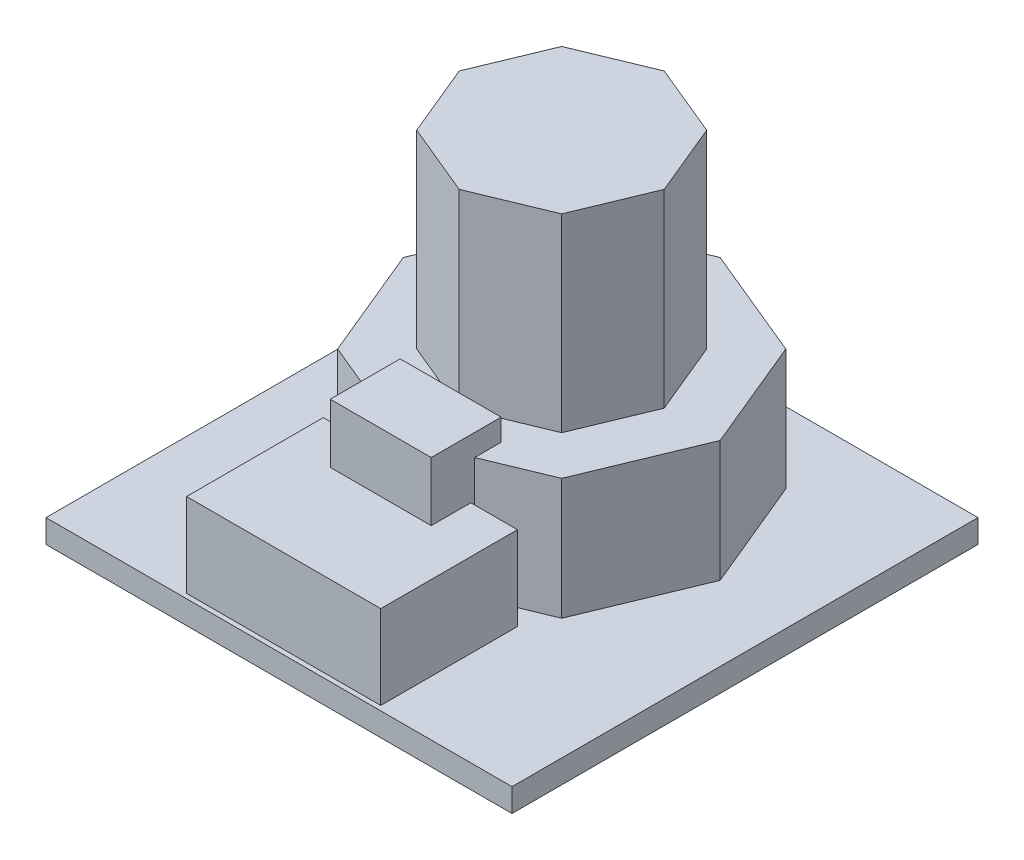
ISO-10303-21;
HEADER;
FILE_DESCRIPTION(('STEP AP214'),'2;1');
FILE_NAME('part.step','',(''),(''),'','','');
FILE_SCHEMA(('AUTOMOTIVE_DESIGN { 1 0 10303 214 1 1 1 1 }'));
ENDSEC;
DATA;
#1=APPLICATION_CONTEXT('core data for automotive mechanical design processes');
#2=APPLICATION_PROTOCOL_DEFINITION('international standard','automotive_design',2000,#1);
#3=PRODUCT_CONTEXT('',#1,'mechanical');
#4=PRODUCT('Part','Part','',(#3));
#5=PRODUCT_RELATED_PRODUCT_CATEGORY('part','',(#4));
#6=PRODUCT_DEFINITION_FORMATION('','',#4);
#7=PRODUCT_DEFINITION_CONTEXT('part definition',#1,'design');
#8=PRODUCT_DEFINITION('design','',#6,#7);
#9=PRODUCT_DEFINITION_SHAPE('','',#8);
#10=(LENGTH_UNIT() NAMED_UNIT(*) SI_UNIT(.MILLI.,.METRE.));
#11=(NAMED_UNIT(*) PLANE_ANGLE_UNIT() SI_UNIT($,.RADIAN.));
#12=(NAMED_UNIT(*) SI_UNIT($,.STERADIAN.) SOLID_ANGLE_UNIT());
#13=UNCERTAINTY_MEASURE_WITH_UNIT(LENGTH_MEASURE(1.E-05),#10,'distance_accuracy_value','');
#14=(GEOMETRIC_REPRESENTATION_CONTEXT(3) GLOBAL_UNCERTAINTY_ASSIGNED_CONTEXT((#13)) GLOBAL_UNIT_ASSIGNED_CONTEXT((#10,
#11,#12)) REPRESENTATION_CONTEXT('',''));
#15=CARTESIAN_POINT('',(0.,0.,0.));
#16=DIRECTION('',(0.,0.,1.));
#17=DIRECTION('',(1.,0.,0.));
#18=AXIS2_PLACEMENT_3D('',#15,#16,#17);
#19=CARTESIAN_POINT('',(0.,0.,0.));
#20=DIRECTION('',(0.,-1.,0.));
#21=DIRECTION('',(0.,0.,-1.));
#22=AXIS2_PLACEMENT_3D('',#19,#20,#21);
#23=PLANE('',#22);
#24=DIRECTION('',(0.,0.,-1.));
#25=VECTOR('',#24,1.);
#26=CARTESIAN_POINT('',(150.,0.,150.));
#27=LINE('',#26,#25);
#28=CARTESIAN_POINT('',(150.,0.,150.));
#29=VERTEX_POINT('',#28);
#30=CARTESIAN_POINT('',(150.,0.,-150.));
#31=VERTEX_POINT('',#30);
#32=EDGE_CURVE('E425',#29,#31,#27,.T.);
#33=ORIENTED_EDGE('',*,*,#32,.T.);
#34=DIRECTION('',(-1.,0.,0.));
#35=VECTOR('',#34,1.);
#36=CARTESIAN_POINT('',(-150.,0.,-150.));
#37=LINE('',#36,#35);
#38=CARTESIAN_POINT('',(-150.,0.,-150.));
#39=VERTEX_POINT('',#38);
#40=EDGE_CURVE('E442',#31,#39,#37,.T.);
#41=ORIENTED_EDGE('',*,*,#40,.T.);
#42=DIRECTION('',(0.,0.,1.));
#43=VECTOR('',#42,1.);
#44=CARTESIAN_POINT('',(-150.,0.,150.));
#45=LINE('',#44,#43);
#46=CARTESIAN_POINT('',(-150.,0.,150.));
#47=VERTEX_POINT('',#46);
#48=EDGE_CURVE('E445',#39,#47,#45,.T.);
#49=ORIENTED_EDGE('',*,*,#48,.T.);
#50=DIRECTION('',(1.,0.,0.));
#51=VECTOR('',#50,1.);
#52=CARTESIAN_POINT('',(-150.,0.,150.));
#53=LINE('',#52,#51);
#54=EDGE_CURVE('E430',#47,#29,#53,.T.);
#55=ORIENTED_EDGE('',*,*,#54,.T.);
#56=EDGE_LOOP('',(#33,#41,#49,#55));
#57=FACE_BOUND('',#56,.T.);
#58=DIRECTION('',(0.,0.,-1.));
#59=VECTOR('',#58,1.);
#60=CARTESIAN_POINT('',(32.5,0.,84.5));
#61=LINE('',#60,#59);
#62=CARTESIAN_POINT('',(32.5,0.,59.));
#63=VERTEX_POINT('',#62);
#64=CARTESIAN_POINT('',(32.5,0.,56.5380592228744));
#65=VERTEX_POINT('',#64);
#66=EDGE_CURVE('E498',#63,#65,#61,.T.);
#67=ORIENTED_EDGE('',*,*,#66,.F.);
#68=DIRECTION('',(-1.,0.,0.));
#69=VECTOR('',#68,1.);
#70=CARTESIAN_POINT('',(-62.5,0.,59.));
#71=LINE('',#70,#69);
#72=CARTESIAN_POINT('',(62.5,0.,59.));
#73=VERTEX_POINT('',#72);
#74=EDGE_CURVE('E305',#73,#63,#71,.T.);
#75=ORIENTED_EDGE('',*,*,#74,.F.);
#76=DIRECTION('',(0.,0.,-1.));
#77=VECTOR('',#76,1.);
#78=CARTESIAN_POINT('',(62.5,0.,147.));
#79=LINE('',#78,#77);
#80=CARTESIAN_POINT('',(62.5,0.,147.));
#81=VERTEX_POINT('',#80);
#82=EDGE_CURVE('E288',#81,#73,#79,.T.);
#83=ORIENTED_EDGE('',*,*,#82,.F.);
#84=DIRECTION('',(1.,0.,0.));
#85=VECTOR('',#84,1.);
#86=CARTESIAN_POINT('',(-62.5,0.,147.));
#87=LINE('',#86,#85);
#88=CARTESIAN_POINT('',(-62.5,0.,147.));
#89=VERTEX_POINT('',#88);
#90=EDGE_CURVE('E293',#89,#81,#87,.T.);
#91=ORIENTED_EDGE('',*,*,#90,.F.);
#92=DIRECTION('',(0.,0.,1.));
#93=VECTOR('',#92,1.);
#94=CARTESIAN_POINT('',(-62.5,0.,147.));
#95=LINE('',#94,#93);
#96=CARTESIAN_POINT('',(-62.5,0.,59.));
#97=VERTEX_POINT('',#96);
#98=EDGE_CURVE('E308',#97,#89,#95,.T.);
#99=ORIENTED_EDGE('',*,*,#98,.F.);
#100=CARTESIAN_POINT('',(-32.5,0.,59.));
#101=VERTEX_POINT('',#100);
#102=EDGE_CURVE('E304',#101,#97,#71,.T.);
#103=ORIENTED_EDGE('',*,*,#102,.F.);
#104=DIRECTION('',(0.,0.,1.));
#105=VECTOR('',#104,1.);
#106=CARTESIAN_POINT('',(-32.5,0.,84.5));
#107=LINE('',#106,#105);
#108=CARTESIAN_POINT('',(-32.5,0.,56.5380592228743));
#109=VERTEX_POINT('',#108);
#110=EDGE_CURVE('E56',#109,#101,#107,.T.);
#111=ORIENTED_EDGE('',*,*,#110,.F.);
#112=DIRECTION('',(0.923879532511289,0.,0.382683432365084));
#113=VECTOR('',#112,1.);
#114=CARTESIAN_POINT('',(-72.1248916810273,0.,40.1248916810283));
#115=LINE('',#114,#113);
#116=CARTESIAN_POINT('',(-72.1248916810273,0.,40.1248916810283));
#117=VERTEX_POINT('',#116);
#118=EDGE_CURVE('E402',#117,#109,#115,.T.);
#119=ORIENTED_EDGE('',*,*,#118,.F.);
#120=DIRECTION('',(0.382683432365096,0.,0.923879532511284));
#121=VECTOR('',#120,1.);
#122=CARTESIAN_POINT('',(-102.,0.,-31.9999999999993));
#123=LINE('',#122,#121);
#124=CARTESIAN_POINT('',(-102.,0.,-31.9999999999993));
#125=VERTEX_POINT('',#124);
#126=EDGE_CURVE('E399',#125,#117,#123,.T.);
#127=ORIENTED_EDGE('',*,*,#126,.F.);
#128=DIRECTION('',(-0.382683432365084,0.,0.923879532511289));
#129=VECTOR('',#128,1.);
#130=CARTESIAN_POINT('',(-72.1248916810283,0.,-104.124891681027));
#131=LINE('',#130,#129);
#132=CARTESIAN_POINT('',(-72.1248916810283,0.,-104.124891681027));
#133=VERTEX_POINT('',#132);
#134=EDGE_CURVE('E396',#133,#125,#131,.T.);
#135=ORIENTED_EDGE('',*,*,#134,.F.);
#136=DIRECTION('',(-0.923879532511284,0.,0.382683432365096));
#137=VECTOR('',#136,1.);
#138=CARTESIAN_POINT('',(-6.24500451351651E-13,0.,-134.));
#139=LINE('',#138,#137);
#140=CARTESIAN_POINT('',(-6.24500451351651E-13,0.,-134.));
#141=VERTEX_POINT('',#140);
#142=EDGE_CURVE('E393',#141,#133,#139,.T.);
#143=ORIENTED_EDGE('',*,*,#142,.F.);
#144=DIRECTION('',(-0.923879532511289,0.,-0.382683432365084));
#145=VECTOR('',#144,1.);
#146=CARTESIAN_POINT('',(72.1248916810273,0.,-104.124891681028));
#147=LINE('',#146,#145);
#148=CARTESIAN_POINT('',(72.1248916810273,0.,-104.124891681028));
#149=VERTEX_POINT('',#148);
#150=EDGE_CURVE('E390',#149,#141,#147,.T.);
#151=ORIENTED_EDGE('',*,*,#150,.F.);
#152=DIRECTION('',(-0.382683432365096,0.,-0.923879532511284));
#153=VECTOR('',#152,1.);
#154=CARTESIAN_POINT('',(102.,0.,-32.0000000000006));
#155=LINE('',#154,#153);
#156=CARTESIAN_POINT('',(102.,0.,-32.0000000000006));
#157=VERTEX_POINT('',#156);
#158=EDGE_CURVE('E387',#157,#149,#155,.T.);
#159=ORIENTED_EDGE('',*,*,#158,.F.);
#160=DIRECTION('',(0.382683432365084,0.,-0.923879532511289));
#161=VECTOR('',#160,1.);
#162=CARTESIAN_POINT('',(72.1248916810283,0.,40.1248916810274));
#163=LINE('',#162,#161);
#164=CARTESIAN_POINT('',(72.1248916810283,0.,40.1248916810274));
#165=VERTEX_POINT('',#164);
#166=EDGE_CURVE('E364',#165,#157,#163,.T.);
#167=ORIENTED_EDGE('',*,*,#166,.F.);
#168=DIRECTION('',(0.923879532511284,0.,-0.382683432365096));
#169=VECTOR('',#168,1.);
#170=CARTESIAN_POINT('',(7.03120562060893E-13,0.,70.));
#171=LINE('',#170,#169);
#172=EDGE_CURVE('E369',#65,#165,#171,.T.);
#173=ORIENTED_EDGE('',*,*,#172,.F.);
#174=EDGE_LOOP('',(#67,#75,#83,#91,#99,#103,#111,#119,#127,#135,#143,#151,#159,#167,#173));
#175=FACE_BOUND('',#174,.T.);
#176=ADVANCED_FACE('F41',(#57,#175),#23,.F.);
#177=CARTESIAN_POINT('',(-72.1248916810273,78.,40.1248916810283));
#178=DIRECTION('',(0.382683432365084,0.,-0.923879532511289));
#179=DIRECTION('',(-0.923879532511289,0.,-0.382683432365084));
#180=AXIS2_PLACEMENT_3D('',#177,#178,#179);
#181=PLANE('',#180);
#182=DIRECTION('',(0.,-1.,0.));
#183=VECTOR('',#182,1.);
#184=CARTESIAN_POINT('',(-32.5,78.,56.5380592228743));
#185=LINE('',#184,#183);
#186=CARTESIAN_POINT('',(-32.5,78.,56.5380592228743));
#187=VERTEX_POINT('',#186);
#188=EDGE_CURVE('E280',#187,#109,#185,.T.);
#189=ORIENTED_EDGE('',*,*,#188,.F.);
#190=DIRECTION('',(0.923879532511289,0.,0.382683432365084));
#191=VECTOR('',#190,1.);
#192=CARTESIAN_POINT('',(-72.1248916810273,78.,40.1248916810283));
#193=LINE('',#192,#191);
#194=CARTESIAN_POINT('',(-72.1248916810273,78.,40.1248916810283));
#195=VERTEX_POINT('',#194);
#196=EDGE_CURVE('E379',#195,#187,#193,.T.);
#197=ORIENTED_EDGE('',*,*,#196,.F.);
#198=DIRECTION('',(0.,-1.,0.));
#199=VECTOR('',#198,1.);
#200=CARTESIAN_POINT('',(-72.1248916810273,78.,40.1248916810283));
#201=LINE('',#200,#199);
#202=EDGE_CURVE('E407',#195,#117,#201,.T.);
#203=ORIENTED_EDGE('',*,*,#202,.T.);
#204=ORIENTED_EDGE('',*,*,#118,.T.);
#205=EDGE_LOOP('',(#189,#197,#203,#204));
#206=FACE_BOUND('',#205,.T.);
#207=ADVANCED_FACE('F509',(#206),#181,.F.);
#208=CARTESIAN_POINT('',(7.03120562060893E-13,78.,70.));
#209=DIRECTION('',(-0.382683432365096,0.,-0.923879532511284));
#210=DIRECTION('',(-0.923879532511285,0.,0.382683432365096));
#211=AXIS2_PLACEMENT_3D('',#208,#209,#210);
#212=PLANE('',#211);
#213=DIRECTION('',(0.,1.,0.));
#214=VECTOR('',#213,1.);
#215=CARTESIAN_POINT('',(32.5,78.,56.5380592228744));
#216=LINE('',#215,#214);
#217=CARTESIAN_POINT('',(32.5,78.,56.5380592228744));
#218=VERTEX_POINT('',#217);
#219=EDGE_CURVE('E64',#65,#218,#216,.T.);
#220=ORIENTED_EDGE('',*,*,#219,.F.);
#221=ORIENTED_EDGE('',*,*,#172,.T.);
#222=DIRECTION('',(0.,-1.,0.));
#223=VECTOR('',#222,1.);
#224=CARTESIAN_POINT('',(72.1248916810283,78.,40.1248916810274));
#225=LINE('',#224,#223);
#226=CARTESIAN_POINT('',(72.1248916810283,78.,40.1248916810274));
#227=VERTEX_POINT('',#226);
#228=EDGE_CURVE('E384',#227,#165,#225,.T.);
#229=ORIENTED_EDGE('',*,*,#228,.F.);
#230=DIRECTION('',(0.923879532511284,0.,-0.382683432365096));
#231=VECTOR('',#230,1.);
#232=CARTESIAN_POINT('',(7.03120562060893E-13,78.,70.));
#233=LINE('',#232,#231);
#234=EDGE_CURVE('E382',#218,#227,#233,.T.);
#235=ORIENTED_EDGE('',*,*,#234,.F.);
#236=EDGE_LOOP('',(#220,#221,#229,#235));
#237=FACE_BOUND('',#236,.T.);
#238=ADVANCED_FACE('F533',(#237),#212,.F.);
#239=CARTESIAN_POINT('',(0.,78.,0.));
#240=DIRECTION('',(0.,1.,0.));
#241=DIRECTION('',(0.,0.,1.));
#242=AXIS2_PLACEMENT_3D('',#239,#240,#241);
#243=PLANE('',#242);
#244=DIRECTION('',(0.382683432365096,0.,0.923879532511284));
#245=VECTOR('',#244,1.);
#246=CARTESIAN_POINT('',(67.6482322781408,78.,-28.0208152801718));
#247=LINE('',#246,#245);
#248=CARTESIAN_POINT('',(46.6690475583118,78.,-78.6690475583125));
#249=VERTEX_POINT('',#248);
#250=CARTESIAN_POINT('',(66.,78.,-32.0000000000004));
#251=VERTEX_POINT('',#250);
#252=EDGE_CURVE('E475',#249,#251,#247,.T.);
#253=ORIENTED_EDGE('',*,*,#252,.T.);
#254=DIRECTION('',(-0.382683432365084,0.,0.923879532511289));
#255=VECTOR('',#254,1.);
#256=CARTESIAN_POINT('',(45.0208152801716,78.,18.6482322781406));
#257=LINE('',#256,#255);
#258=CARTESIAN_POINT('',(46.6690475583124,78.,14.6690475583119));
#259=VERTEX_POINT('',#258);
#260=EDGE_CURVE('E478',#251,#259,#257,.T.);
#261=ORIENTED_EDGE('',*,*,#260,.T.);
#262=DIRECTION('',(-0.923879532511285,0.,0.382683432365095));
#263=VECTOR('',#262,1.);
#264=CARTESIAN_POINT('',(12.0208152801715,78.,29.0208152801713));
#265=LINE('',#264,#263);
#266=CARTESIAN_POINT('',(4.28476698566271E-13,78.,34.));
#267=VERTEX_POINT('',#266);
#268=EDGE_CURVE('E452',#259,#267,#265,.T.);
#269=ORIENTED_EDGE('',*,*,#268,.T.);
#270=DIRECTION('',(-0.923879532511289,0.,-0.382683432365084));
#271=VECTOR('',#270,1.);
#272=CARTESIAN_POINT('',(-12.0208152801711,78.,29.0208152801713));
#273=LINE('',#272,#271);
#274=CARTESIAN_POINT('',(-46.6690475583118,78.,14.6690475583124));
#275=VERTEX_POINT('',#274);
#276=EDGE_CURVE('E460',#267,#275,#273,.T.);
#277=ORIENTED_EDGE('',*,*,#276,.T.);
#278=DIRECTION('',(-0.382683432365096,0.,-0.923879532511284));
#279=VECTOR('',#278,1.);
#280=CARTESIAN_POINT('',(-45.020815280171,78.,18.648232278141));
#281=LINE('',#280,#279);
#282=CARTESIAN_POINT('',(-66.,78.,-31.9999999999995));
#283=VERTEX_POINT('',#282);
#284=EDGE_CURVE('E463',#275,#283,#281,.T.);
#285=ORIENTED_EDGE('',*,*,#284,.T.);
#286=DIRECTION('',(0.382683432365083,0.,-0.92387953251129));
#287=VECTOR('',#286,1.);
#288=CARTESIAN_POINT('',(-67.6482322781408,78.,-28.0208152801707));
#289=LINE('',#288,#287);
#290=CARTESIAN_POINT('',(-46.6690475583124,78.,-78.6690475583118));
#291=VERTEX_POINT('',#290);
#292=EDGE_CURVE('E466',#283,#291,#289,.T.);
#293=ORIENTED_EDGE('',*,*,#292,.T.);
#294=DIRECTION('',(0.923879532511285,0.,-0.382683432365096));
#295=VECTOR('',#294,1.);
#296=CARTESIAN_POINT('',(-34.6482322781413,78.,-83.6482322781406));
#297=LINE('',#296,#295);
#298=CARTESIAN_POINT('',(-3.95516952522712E-13,78.,-98.));
#299=VERTEX_POINT('',#298);
#300=EDGE_CURVE('E469',#291,#299,#297,.T.);
#301=ORIENTED_EDGE('',*,*,#300,.T.);
#302=DIRECTION('',(0.923879532511289,0.,0.382683432365084));
#303=VECTOR('',#302,1.);
#304=CARTESIAN_POINT('',(34.6482322781403,78.,-83.6482322781411));
#305=LINE('',#304,#303);
#306=EDGE_CURVE('E472',#299,#249,#305,.T.);
#307=ORIENTED_EDGE('',*,*,#306,.T.);
#308=EDGE_LOOP('',(#253,#261,#269,#277,#285,#293,#301,#307));
#309=FACE_BOUND('',#308,.T.);
#310=DIRECTION('',(1.,0.,0.));
#311=VECTOR('',#310,1.);
#312=CARTESIAN_POINT('',(0.,78.,39.5));
#313=LINE('',#312,#311);
#314=CARTESIAN_POINT('',(-32.5,78.,39.5));
#315=VERTEX_POINT('',#314);
#316=CARTESIAN_POINT('',(32.5,78.,39.5));
#317=VERTEX_POINT('',#316);
#318=EDGE_CURVE('E11',#315,#317,#313,.T.);
#319=ORIENTED_EDGE('',*,*,#318,.T.);
#320=DIRECTION('',(0.,0.,1.));
#321=VECTOR('',#320,1.);
#322=CARTESIAN_POINT('',(32.5,78.,0.));
#323=LINE('',#322,#321);
#324=EDGE_CURVE('E269',#317,#218,#323,.T.);
#325=ORIENTED_EDGE('',*,*,#324,.T.);
#326=ORIENTED_EDGE('',*,*,#234,.T.);
#327=DIRECTION('',(0.382683432365084,0.,-0.923879532511289));
#328=VECTOR('',#327,1.);
#329=CARTESIAN_POINT('',(72.1248916810283,78.,40.1248916810274));
#330=LINE('',#329,#328);
#331=CARTESIAN_POINT('',(102.,78.,-32.0000000000006));
#332=VERTEX_POINT('',#331);
#333=EDGE_CURVE('E365',#227,#332,#330,.T.);
#334=ORIENTED_EDGE('',*,*,#333,.T.);
#335=DIRECTION('',(-0.382683432365096,0.,-0.923879532511284));
#336=VECTOR('',#335,1.);
#337=CARTESIAN_POINT('',(102.,78.,-32.0000000000006));
#338=LINE('',#337,#336);
#339=CARTESIAN_POINT('',(72.1248916810273,78.,-104.124891681028));
#340=VERTEX_POINT('',#339);
#341=EDGE_CURVE('E368',#332,#340,#338,.T.);
#342=ORIENTED_EDGE('',*,*,#341,.T.);
#343=DIRECTION('',(-0.923879532511289,0.,-0.382683432365084));
#344=VECTOR('',#343,1.);
#345=CARTESIAN_POINT('',(72.1248916810273,78.,-104.124891681028));
#346=LINE('',#345,#344);
#347=CARTESIAN_POINT('',(-6.24500451351651E-13,78.,-134.));
#348=VERTEX_POINT('',#347);
#349=EDGE_CURVE('E371',#340,#348,#346,.T.);
#350=ORIENTED_EDGE('',*,*,#349,.T.);
#351=DIRECTION('',(-0.923879532511284,0.,0.382683432365096));
#352=VECTOR('',#351,1.);
#353=CARTESIAN_POINT('',(-6.24500451351651E-13,78.,-134.));
#354=LINE('',#353,#352);
#355=CARTESIAN_POINT('',(-72.1248916810283,78.,-104.124891681027));
#356=VERTEX_POINT('',#355);
#357=EDGE_CURVE('E373',#348,#356,#354,.T.);
#358=ORIENTED_EDGE('',*,*,#357,.T.);
#359=DIRECTION('',(-0.382683432365084,0.,0.923879532511289));
#360=VECTOR('',#359,1.);
#361=CARTESIAN_POINT('',(-72.1248916810283,78.,-104.124891681027));
#362=LINE('',#361,#360);
#363=CARTESIAN_POINT('',(-102.,78.,-31.9999999999993));
#364=VERTEX_POINT('',#363);
#365=EDGE_CURVE('E375',#356,#364,#362,.T.);
#366=ORIENTED_EDGE('',*,*,#365,.T.);
#367=DIRECTION('',(0.382683432365096,0.,0.923879532511284));
#368=VECTOR('',#367,1.);
#369=CARTESIAN_POINT('',(-102.,78.,-31.9999999999993));
#370=LINE('',#369,#368);
#371=EDGE_CURVE('E377',#364,#195,#370,.T.);
#372=ORIENTED_EDGE('',*,*,#371,.T.);
#373=ORIENTED_EDGE('',*,*,#196,.T.);
#374=DIRECTION('',(0.,0.,-1.));
#375=VECTOR('',#374,1.);
#376=CARTESIAN_POINT('',(-32.5,78.,0.));
#377=LINE('',#376,#375);
#378=EDGE_CURVE('E273',#187,#315,#377,.T.);
#379=ORIENTED_EDGE('',*,*,#378,.T.);
#380=EDGE_LOOP('',(#319,#325,#326,#334,#342,#350,#358,#366,#372,#373,#379));
#381=FACE_BOUND('',#380,.T.);
#382=ADVANCED_FACE('F504',(#309,#381),#243,.T.);
#383=CARTESIAN_POINT('',(-62.5,54.,59.));
#384=DIRECTION('',(0.,0.,1.));
#385=DIRECTION('',(1.,0.,0.));
#386=AXIS2_PLACEMENT_3D('',#383,#384,#385);
#387=PLANE('',#386);
#388=DIRECTION('',(0.,1.,0.));
#389=VECTOR('',#388,1.);
#390=CARTESIAN_POINT('',(-32.5,54.,59.));
#391=LINE('',#390,#389);
#392=CARTESIAN_POINT('',(-32.5,54.,59.));
#393=VERTEX_POINT('',#392);
#394=EDGE_CURVE('E270',#101,#393,#391,.T.);
#395=ORIENTED_EDGE('',*,*,#394,.F.);
#396=ORIENTED_EDGE('',*,*,#102,.T.);
#397=DIRECTION('',(0.,-1.,0.));
#398=VECTOR('',#397,1.);
#399=CARTESIAN_POINT('',(-62.5,54.,59.));
#400=LINE('',#399,#398);
#401=CARTESIAN_POINT('',(-62.5,54.,59.));
#402=VERTEX_POINT('',#401);
#403=EDGE_CURVE('E318',#402,#97,#400,.T.);
#404=ORIENTED_EDGE('',*,*,#403,.F.);
#405=DIRECTION('',(-1.,0.,0.));
#406=VECTOR('',#405,1.);
#407=CARTESIAN_POINT('',(-62.5,54.,59.));
#408=LINE('',#407,#406);
#409=EDGE_CURVE('E292',#393,#402,#408,.T.);
#410=ORIENTED_EDGE('',*,*,#409,.F.);
#411=EDGE_LOOP('',(#395,#396,#404,#410));
#412=FACE_BOUND('',#411,.T.);
#413=ADVANCED_FACE('F540',(#412),#387,.F.);
#414=DIRECTION('',(0.,-1.,0.));
#415=VECTOR('',#414,1.);
#416=CARTESIAN_POINT('',(32.5,54.,59.));
#417=LINE('',#416,#415);
#418=CARTESIAN_POINT('',(32.5,54.,59.));
#419=VERTEX_POINT('',#418);
#420=EDGE_CURVE('E283',#419,#63,#417,.T.);
#421=ORIENTED_EDGE('',*,*,#420,.F.);
#422=CARTESIAN_POINT('',(62.5,54.,59.));
#423=VERTEX_POINT('',#422);
#424=EDGE_CURVE('E294',#423,#419,#408,.T.);
#425=ORIENTED_EDGE('',*,*,#424,.F.);
#426=DIRECTION('',(0.,-1.,0.));
#427=VECTOR('',#426,1.);
#428=CARTESIAN_POINT('',(62.5,54.,59.));
#429=LINE('',#428,#427);
#430=EDGE_CURVE('E321',#423,#73,#429,.T.);
#431=ORIENTED_EDGE('',*,*,#430,.T.);
#432=ORIENTED_EDGE('',*,*,#74,.T.);
#433=EDGE_LOOP('',(#421,#425,#431,#432));
#434=FACE_BOUND('',#433,.T.);
#435=ADVANCED_FACE('F581',(#434),#387,.F.);
#436=CARTESIAN_POINT('',(0.,54.,0.));
#437=DIRECTION('',(0.,-1.,0.));
#438=DIRECTION('',(0.,0.,-1.));
#439=AXIS2_PLACEMENT_3D('',#436,#437,#438);
#440=PLANE('',#439);
#441=DIRECTION('',(0.,0.,-1.));
#442=VECTOR('',#441,1.);
#443=CARTESIAN_POINT('',(32.5,54.,0.));
#444=LINE('',#443,#442);
#445=CARTESIAN_POINT('',(32.5,54.,84.5));
#446=VERTEX_POINT('',#445);
#447=EDGE_CURVE('E49',#446,#419,#444,.T.);
#448=ORIENTED_EDGE('',*,*,#447,.F.);
#449=DIRECTION('',(1.,0.,0.));
#450=VECTOR('',#449,1.);
#451=CARTESIAN_POINT('',(0.,54.,84.5));
#452=LINE('',#451,#450);
#453=CARTESIAN_POINT('',(-32.5,54.,84.5));
#454=VERTEX_POINT('',#453);
#455=EDGE_CURVE('E481',#454,#446,#452,.T.);
#456=ORIENTED_EDGE('',*,*,#455,.F.);
#457=DIRECTION('',(0.,0.,1.));
#458=VECTOR('',#457,1.);
#459=CARTESIAN_POINT('',(-32.5,54.,0.));
#460=LINE('',#459,#458);
#461=EDGE_CURVE('E484',#393,#454,#460,.T.);
#462=ORIENTED_EDGE('',*,*,#461,.F.);
#463=ORIENTED_EDGE('',*,*,#409,.T.);
#464=DIRECTION('',(0.,0.,1.));
#465=VECTOR('',#464,1.);
#466=CARTESIAN_POINT('',(-62.5,54.,147.));
#467=LINE('',#466,#465);
#468=CARTESIAN_POINT('',(-62.5,54.,147.));
#469=VERTEX_POINT('',#468);
#470=EDGE_CURVE('E297',#402,#469,#467,.T.);
#471=ORIENTED_EDGE('',*,*,#470,.T.);
#472=DIRECTION('',(1.,0.,0.));
#473=VECTOR('',#472,1.);
#474=CARTESIAN_POINT('',(-62.5,54.,147.));
#475=LINE('',#474,#473);
#476=CARTESIAN_POINT('',(62.5,54.,147.));
#477=VERTEX_POINT('',#476);
#478=EDGE_CURVE('E299',#469,#477,#475,.T.);
#479=ORIENTED_EDGE('',*,*,#478,.T.);
#480=DIRECTION('',(0.,0.,-1.));
#481=VECTOR('',#480,1.);
#482=CARTESIAN_POINT('',(62.5,54.,147.));
#483=LINE('',#482,#481);
#484=EDGE_CURVE('E289',#477,#423,#483,.T.);
#485=ORIENTED_EDGE('',*,*,#484,.T.);
#486=ORIENTED_EDGE('',*,*,#424,.T.);
#487=EDGE_LOOP('',(#448,#456,#462,#463,#471,#479,#485,#486));
#488=FACE_BOUND('',#487,.T.);
#489=ADVANCED_FACE('F489',(#488),#440,.F.);
#490=CARTESIAN_POINT('',(150.,-15.,150.));
#491=DIRECTION('',(1.,0.,0.));
#492=DIRECTION('',(0.,0.,-1.));
#493=AXIS2_PLACEMENT_3D('',#490,#491,#492);
#494=PLANE('',#493);
#495=ORIENTED_EDGE('',*,*,#32,.F.);
#496=DIRECTION('',(0.,1.,0.));
#497=VECTOR('',#496,1.);
#498=CARTESIAN_POINT('',(150.,-15.,150.));
#499=LINE('',#498,#497);
#500=CARTESIAN_POINT('',(150.,-15.,150.));
#501=VERTEX_POINT('',#500);
#502=EDGE_CURVE('E450',#501,#29,#499,.T.);
#503=ORIENTED_EDGE('',*,*,#502,.F.);
#504=DIRECTION('',(0.,0.,-1.));
#505=VECTOR('',#504,1.);
#506=CARTESIAN_POINT('',(150.,-15.,150.));
#507=LINE('',#506,#505);
#508=CARTESIAN_POINT('',(150.,-15.,-150.));
#509=VERTEX_POINT('',#508);
#510=EDGE_CURVE('E426',#501,#509,#507,.T.);
#511=ORIENTED_EDGE('',*,*,#510,.T.);
#512=DIRECTION('',(0.,1.,0.));
#513=VECTOR('',#512,1.);
#514=CARTESIAN_POINT('',(150.,-15.,-150.));
#515=LINE('',#514,#513);
#516=EDGE_CURVE('E439',#509,#31,#515,.T.);
#517=ORIENTED_EDGE('',*,*,#516,.T.);
#518=EDGE_LOOP('',(#495,#503,#511,#517));
#519=FACE_BOUND('',#518,.T.);
#520=ADVANCED_FACE('F43',(#519),#494,.T.);
#521=CARTESIAN_POINT('',(-150.,-15.,150.));
#522=DIRECTION('',(0.,0.,1.));
#523=DIRECTION('',(1.,0.,0.));
#524=AXIS2_PLACEMENT_3D('',#521,#522,#523);
#525=PLANE('',#524);
#526=ORIENTED_EDGE('',*,*,#54,.F.);
#527=DIRECTION('',(0.,1.,0.));
#528=VECTOR('',#527,1.);
#529=CARTESIAN_POINT('',(-150.,-15.,150.));
#530=LINE('',#529,#528);
#531=CARTESIAN_POINT('',(-150.,-15.,150.));
#532=VERTEX_POINT('',#531);
#533=EDGE_CURVE('E453',#532,#47,#530,.T.);
#534=ORIENTED_EDGE('',*,*,#533,.F.);
#535=DIRECTION('',(1.,0.,0.));
#536=VECTOR('',#535,1.);
#537=CARTESIAN_POINT('',(-150.,-15.,150.));
#538=LINE('',#537,#536);
#539=EDGE_CURVE('E436',#532,#501,#538,.T.);
#540=ORIENTED_EDGE('',*,*,#539,.T.);
#541=ORIENTED_EDGE('',*,*,#502,.T.);
#542=EDGE_LOOP('',(#526,#534,#540,#541));
#543=FACE_BOUND('',#542,.T.);
#544=ADVANCED_FACE('F554',(#543),#525,.T.);
#545=CARTESIAN_POINT('',(-150.,-15.,150.));
#546=DIRECTION('',(-1.,0.,0.));
#547=DIRECTION('',(0.,0.,1.));
#548=AXIS2_PLACEMENT_3D('',#545,#546,#547);
#549=PLANE('',#548);
#550=ORIENTED_EDGE('',*,*,#48,.F.);
#551=DIRECTION('',(0.,1.,0.));
#552=VECTOR('',#551,1.);
#553=CARTESIAN_POINT('',(-150.,-15.,-150.));
#554=LINE('',#553,#552);
#555=CARTESIAN_POINT('',(-150.,-15.,-150.));
#556=VERTEX_POINT('',#555);
#557=EDGE_CURVE('E455',#556,#39,#554,.T.);
#558=ORIENTED_EDGE('',*,*,#557,.F.);
#559=DIRECTION('',(0.,0.,1.));
#560=VECTOR('',#559,1.);
#561=CARTESIAN_POINT('',(-150.,-15.,150.));
#562=LINE('',#561,#560);
#563=EDGE_CURVE('E433',#556,#532,#562,.T.);
#564=ORIENTED_EDGE('',*,*,#563,.T.);
#565=ORIENTED_EDGE('',*,*,#533,.T.);
#566=EDGE_LOOP('',(#550,#558,#564,#565));
#567=FACE_BOUND('',#566,.T.);
#568=ADVANCED_FACE('F557',(#567),#549,.T.);
#569=CARTESIAN_POINT('',(-150.,-15.,-150.));
#570=DIRECTION('',(0.,0.,-1.));
#571=DIRECTION('',(-1.,0.,0.));
#572=AXIS2_PLACEMENT_3D('',#569,#570,#571);
#573=PLANE('',#572);
#574=ORIENTED_EDGE('',*,*,#40,.F.);
#575=ORIENTED_EDGE('',*,*,#516,.F.);
#576=DIRECTION('',(-1.,0.,0.));
#577=VECTOR('',#576,1.);
#578=CARTESIAN_POINT('',(-150.,-15.,-150.));
#579=LINE('',#578,#577);
#580=EDGE_CURVE('E429',#509,#556,#579,.T.);
#581=ORIENTED_EDGE('',*,*,#580,.T.);
#582=ORIENTED_EDGE('',*,*,#557,.T.);
#583=EDGE_LOOP('',(#574,#575,#581,#582));
#584=FACE_BOUND('',#583,.T.);
#585=ADVANCED_FACE('F560',(#584),#573,.T.);
#586=CARTESIAN_POINT('',(0.,-15.,0.));
#587=DIRECTION('',(0.,-1.,0.));
#588=DIRECTION('',(0.,0.,-1.));
#589=AXIS2_PLACEMENT_3D('',#586,#587,#588);
#590=PLANE('',#589);
#591=ORIENTED_EDGE('',*,*,#510,.F.);
#592=ORIENTED_EDGE('',*,*,#539,.F.);
#593=ORIENTED_EDGE('',*,*,#563,.F.);
#594=ORIENTED_EDGE('',*,*,#580,.F.);
#595=EDGE_LOOP('',(#591,#592,#593,#594));
#596=FACE_BOUND('',#595,.T.);
#597=ADVANCED_FACE('F552',(#596),#590,.T.);
#598=CARTESIAN_POINT('',(72.1248916810283,78.,40.1248916810274));
#599=DIRECTION('',(-0.923879532511289,0.,-0.382683432365084));
#600=DIRECTION('',(-0.382683432365084,0.,0.923879532511289));
#601=AXIS2_PLACEMENT_3D('',#598,#599,#600);
#602=PLANE('',#601);
#603=ORIENTED_EDGE('',*,*,#166,.T.);
#604=DIRECTION('',(0.,-1.,0.));
#605=VECTOR('',#604,1.);
#606=CARTESIAN_POINT('',(102.,78.,-32.0000000000006));
#607=LINE('',#606,#605);
#608=EDGE_CURVE('E422',#332,#157,#607,.T.);
#609=ORIENTED_EDGE('',*,*,#608,.F.);
#610=ORIENTED_EDGE('',*,*,#333,.F.);
#611=ORIENTED_EDGE('',*,*,#228,.T.);
#612=EDGE_LOOP('',(#603,#609,#610,#611));
#613=FACE_BOUND('',#612,.T.);
#614=ADVANCED_FACE('F531',(#613),#602,.F.);
#615=CARTESIAN_POINT('',(102.,78.,-32.0000000000006));
#616=DIRECTION('',(-0.923879532511284,0.,0.382683432365096));
#617=DIRECTION('',(0.382683432365096,0.,0.923879532511285));
#618=AXIS2_PLACEMENT_3D('',#615,#616,#617);
#619=PLANE('',#618);
#620=ORIENTED_EDGE('',*,*,#158,.T.);
#621=DIRECTION('',(0.,-1.,0.));
#622=VECTOR('',#621,1.);
#623=CARTESIAN_POINT('',(72.1248916810273,78.,-104.124891681028));
#624=LINE('',#623,#622);
#625=EDGE_CURVE('E419',#340,#149,#624,.T.);
#626=ORIENTED_EDGE('',*,*,#625,.F.);
#627=ORIENTED_EDGE('',*,*,#341,.F.);
#628=ORIENTED_EDGE('',*,*,#608,.T.);
#629=EDGE_LOOP('',(#620,#626,#627,#628));
#630=FACE_BOUND('',#629,.T.);
#631=ADVANCED_FACE('F527',(#630),#619,.F.);
#632=CARTESIAN_POINT('',(72.1248916810273,78.,-104.124891681028));
#633=DIRECTION('',(-0.382683432365084,0.,0.923879532511289));
#634=DIRECTION('',(0.923879532511289,0.,0.382683432365084));
#635=AXIS2_PLACEMENT_3D('',#632,#633,#634);
#636=PLANE('',#635);
#637=ORIENTED_EDGE('',*,*,#150,.T.);
#638=DIRECTION('',(0.,-1.,0.));
#639=VECTOR('',#638,1.);
#640=CARTESIAN_POINT('',(-6.24500451351651E-13,78.,-134.));
#641=LINE('',#640,#639);
#642=EDGE_CURVE('E416',#348,#141,#641,.T.);
#643=ORIENTED_EDGE('',*,*,#642,.F.);
#644=ORIENTED_EDGE('',*,*,#349,.F.);
#645=ORIENTED_EDGE('',*,*,#625,.T.);
#646=EDGE_LOOP('',(#637,#643,#644,#645));
#647=FACE_BOUND('',#646,.T.);
#648=ADVANCED_FACE('F523',(#647),#636,.F.);
#649=CARTESIAN_POINT('',(-6.24500451351651E-13,78.,-134.));
#650=DIRECTION('',(0.382683432365096,0.,0.923879532511284));
#651=DIRECTION('',(0.923879532511284,0.,-0.382683432365096));
#652=AXIS2_PLACEMENT_3D('',#649,#650,#651);
#653=PLANE('',#652);
#654=ORIENTED_EDGE('',*,*,#142,.T.);
#655=DIRECTION('',(0.,-1.,0.));
#656=VECTOR('',#655,1.);
#657=CARTESIAN_POINT('',(-72.1248916810283,78.,-104.124891681027));
#658=LINE('',#657,#656);
#659=EDGE_CURVE('E413',#356,#133,#658,.T.);
#660=ORIENTED_EDGE('',*,*,#659,.F.);
#661=ORIENTED_EDGE('',*,*,#357,.F.);
#662=ORIENTED_EDGE('',*,*,#642,.T.);
#663=EDGE_LOOP('',(#654,#660,#661,#662));
#664=FACE_BOUND('',#663,.T.);
#665=ADVANCED_FACE('F518',(#664),#653,.F.);
#666=CARTESIAN_POINT('',(-72.1248916810283,78.,-104.124891681027));
#667=DIRECTION('',(0.923879532511289,0.,0.382683432365084));
#668=DIRECTION('',(0.382683432365084,0.,-0.92387953251129));
#669=AXIS2_PLACEMENT_3D('',#666,#667,#668);
#670=PLANE('',#669);
#671=ORIENTED_EDGE('',*,*,#134,.T.);
#672=DIRECTION('',(0.,-1.,0.));
#673=VECTOR('',#672,1.);
#674=CARTESIAN_POINT('',(-102.,78.,-31.9999999999993));
#675=LINE('',#674,#673);
#676=EDGE_CURVE('E410',#364,#125,#675,.T.);
#677=ORIENTED_EDGE('',*,*,#676,.F.);
#678=ORIENTED_EDGE('',*,*,#365,.F.);
#679=ORIENTED_EDGE('',*,*,#659,.T.);
#680=EDGE_LOOP('',(#671,#677,#678,#679));
#681=FACE_BOUND('',#680,.T.);
#682=ADVANCED_FACE('F515',(#681),#670,.F.);
#683=CARTESIAN_POINT('',(-102.,78.,-31.9999999999993));
#684=DIRECTION('',(0.923879532511284,0.,-0.382683432365096));
#685=DIRECTION('',(-0.382683432365096,0.,-0.923879532511284));
#686=AXIS2_PLACEMENT_3D('',#683,#684,#685);
#687=PLANE('',#686);
#688=ORIENTED_EDGE('',*,*,#126,.T.);
#689=ORIENTED_EDGE('',*,*,#202,.F.);
#690=ORIENTED_EDGE('',*,*,#371,.F.);
#691=ORIENTED_EDGE('',*,*,#676,.T.);
#692=EDGE_LOOP('',(#688,#689,#690,#691));
#693=FACE_BOUND('',#692,.T.);
#694=ADVANCED_FACE('F511',(#693),#687,.F.);
#695=CARTESIAN_POINT('',(46.6690475583124,200.,14.6690475583119));
#696=DIRECTION('',(-0.923879532511289,0.,-0.382683432365084));
#697=DIRECTION('',(-0.382683432365084,0.,0.923879532511289));
#698=AXIS2_PLACEMENT_3D('',#695,#696,#697);
#699=PLANE('',#698);
#700=ORIENTED_EDGE('',*,*,#260,.F.);
#701=DIRECTION('',(0.,-1.,0.));
#702=VECTOR('',#701,1.);
#703=CARTESIAN_POINT('',(66.,200.,-32.0000000000004));
#704=LINE('',#703,#702);
#705=CARTESIAN_POINT('',(66.,200.,-32.0000000000004));
#706=VERTEX_POINT('',#705);
#707=EDGE_CURVE('E361',#706,#251,#704,.T.);
#708=ORIENTED_EDGE('',*,*,#707,.F.);
#709=DIRECTION('',(0.382683432365084,0.,-0.923879532511289));
#710=VECTOR('',#709,1.);
#711=CARTESIAN_POINT('',(46.6690475583124,200.,14.6690475583119));
#712=LINE('',#711,#710);
#713=CARTESIAN_POINT('',(46.6690475583124,200.,14.6690475583119));
#714=VERTEX_POINT('',#713);
#715=EDGE_CURVE('E324',#714,#706,#712,.T.);
#716=ORIENTED_EDGE('',*,*,#715,.F.);
#717=DIRECTION('',(0.,-1.,0.));
#718=VECTOR('',#717,1.);
#719=CARTESIAN_POINT('',(46.6690475583124,200.,14.6690475583119));
#720=LINE('',#719,#718);
#721=EDGE_CURVE('E341',#714,#259,#720,.T.);
#722=ORIENTED_EDGE('',*,*,#721,.T.);
#723=EDGE_LOOP('',(#700,#708,#716,#722));
#724=FACE_BOUND('',#723,.T.);
#725=ADVANCED_FACE('F636',(#724),#699,.F.);
#726=CARTESIAN_POINT('',(66.,200.,-32.0000000000004));
#727=DIRECTION('',(-0.923879532511284,0.,0.382683432365096));
#728=DIRECTION('',(0.382683432365096,0.,0.923879532511284));
#729=AXIS2_PLACEMENT_3D('',#726,#727,#728);
#730=PLANE('',#729);
#731=ORIENTED_EDGE('',*,*,#252,.F.);
#732=DIRECTION('',(0.,-1.,0.));
#733=VECTOR('',#732,1.);
#734=CARTESIAN_POINT('',(46.6690475583118,200.,-78.6690475583125));
#735=LINE('',#734,#733);
#736=CARTESIAN_POINT('',(46.6690475583118,200.,-78.6690475583125));
#737=VERTEX_POINT('',#736);
#738=EDGE_CURVE('E358',#737,#249,#735,.T.);
#739=ORIENTED_EDGE('',*,*,#738,.F.);
#740=DIRECTION('',(-0.382683432365096,0.,-0.923879532511284));
#741=VECTOR('',#740,1.);
#742=CARTESIAN_POINT('',(66.,200.,-32.0000000000004));
#743=LINE('',#742,#741);
#744=EDGE_CURVE('E327',#706,#737,#743,.T.);
#745=ORIENTED_EDGE('',*,*,#744,.F.);
#746=ORIENTED_EDGE('',*,*,#707,.T.);
#747=EDGE_LOOP('',(#731,#739,#745,#746));
#748=FACE_BOUND('',#747,.T.);
#749=ADVANCED_FACE('F632',(#748),#730,.F.);
#750=CARTESIAN_POINT('',(46.6690475583118,200.,-78.6690475583125));
#751=DIRECTION('',(-0.382683432365084,0.,0.923879532511289));
#752=DIRECTION('',(0.923879532511289,0.,0.382683432365084));
#753=AXIS2_PLACEMENT_3D('',#750,#751,#752);
#754=PLANE('',#753);
#755=ORIENTED_EDGE('',*,*,#306,.F.);
#756=DIRECTION('',(0.,-1.,0.));
#757=VECTOR('',#756,1.);
#758=CARTESIAN_POINT('',(-3.95516952522712E-13,200.,-98.));
#759=LINE('',#758,#757);
#760=CARTESIAN_POINT('',(-3.95516952522712E-13,200.,-98.));
#761=VERTEX_POINT('',#760);
#762=EDGE_CURVE('E355',#761,#299,#759,.T.);
#763=ORIENTED_EDGE('',*,*,#762,.F.);
#764=DIRECTION('',(-0.923879532511289,0.,-0.382683432365084));
#765=VECTOR('',#764,1.);
#766=CARTESIAN_POINT('',(46.6690475583118,200.,-78.6690475583125));
#767=LINE('',#766,#765);
#768=EDGE_CURVE('E329',#737,#761,#767,.T.);
#769=ORIENTED_EDGE('',*,*,#768,.F.);
#770=ORIENTED_EDGE('',*,*,#738,.T.);
#771=EDGE_LOOP('',(#755,#763,#769,#770));
#772=FACE_BOUND('',#771,.T.);
#773=ADVANCED_FACE('F628',(#772),#754,.F.);
#774=CARTESIAN_POINT('',(-3.95516952522712E-13,200.,-98.));
#775=DIRECTION('',(0.382683432365095,0.,0.923879532511284));
#776=DIRECTION('',(0.923879532511285,0.,-0.382683432365096));
#777=AXIS2_PLACEMENT_3D('',#774,#775,#776);
#778=PLANE('',#777);
#779=ORIENTED_EDGE('',*,*,#300,.F.);
#780=DIRECTION('',(0.,-1.,0.));
#781=VECTOR('',#780,1.);
#782=CARTESIAN_POINT('',(-46.6690475583124,200.,-78.6690475583118));
#783=LINE('',#782,#781);
#784=CARTESIAN_POINT('',(-46.6690475583124,200.,-78.6690475583118));
#785=VERTEX_POINT('',#784);
#786=EDGE_CURVE('E352',#785,#291,#783,.T.);
#787=ORIENTED_EDGE('',*,*,#786,.F.);
#788=DIRECTION('',(-0.923879532511284,0.,0.382683432365095));
#789=VECTOR('',#788,1.);
#790=CARTESIAN_POINT('',(-3.95516952522712E-13,200.,-98.));
#791=LINE('',#790,#789);
#792=EDGE_CURVE('E331',#761,#785,#791,.T.);
#793=ORIENTED_EDGE('',*,*,#792,.F.);
#794=ORIENTED_EDGE('',*,*,#762,.T.);
#795=EDGE_LOOP('',(#779,#787,#793,#794));
#796=FACE_BOUND('',#795,.T.);
#797=ADVANCED_FACE('F624',(#796),#778,.F.);
#798=CARTESIAN_POINT('',(-46.6690475583124,200.,-78.6690475583118));
#799=DIRECTION('',(0.92387953251129,0.,0.382683432365083));
#800=DIRECTION('',(0.382683432365083,0.,-0.92387953251129));
#801=AXIS2_PLACEMENT_3D('',#798,#799,#800);
#802=PLANE('',#801);
#803=ORIENTED_EDGE('',*,*,#292,.F.);
#804=DIRECTION('',(0.,-1.,0.));
#805=VECTOR('',#804,1.);
#806=CARTESIAN_POINT('',(-66.,200.,-31.9999999999995));
#807=LINE('',#806,#805);
#808=CARTESIAN_POINT('',(-66.,200.,-31.9999999999995));
#809=VERTEX_POINT('',#808);
#810=EDGE_CURVE('E349',#809,#283,#807,.T.);
#811=ORIENTED_EDGE('',*,*,#810,.F.);
#812=DIRECTION('',(-0.382683432365083,0.,0.92387953251129));
#813=VECTOR('',#812,1.);
#814=CARTESIAN_POINT('',(-46.6690475583124,200.,-78.6690475583118));
#815=LINE('',#814,#813);
#816=EDGE_CURVE('E333',#785,#809,#815,.T.);
#817=ORIENTED_EDGE('',*,*,#816,.F.);
#818=ORIENTED_EDGE('',*,*,#786,.T.);
#819=EDGE_LOOP('',(#803,#811,#817,#818));
#820=FACE_BOUND('',#819,.T.);
#821=ADVANCED_FACE('F620',(#820),#802,.F.);
#822=CARTESIAN_POINT('',(-66.,200.,-31.9999999999995));
#823=DIRECTION('',(0.923879532511284,0.,-0.382683432365096));
#824=DIRECTION('',(-0.382683432365096,0.,-0.923879532511284));
#825=AXIS2_PLACEMENT_3D('',#822,#823,#824);
#826=PLANE('',#825);
#827=ORIENTED_EDGE('',*,*,#284,.F.);
#828=DIRECTION('',(0.,-1.,0.));
#829=VECTOR('',#828,1.);
#830=CARTESIAN_POINT('',(-46.6690475583118,200.,14.6690475583124));
#831=LINE('',#830,#829);
#832=CARTESIAN_POINT('',(-46.6690475583118,200.,14.6690475583124));
#833=VERTEX_POINT('',#832);
#834=EDGE_CURVE('E346',#833,#275,#831,.T.);
#835=ORIENTED_EDGE('',*,*,#834,.F.);
#836=DIRECTION('',(0.382683432365096,0.,0.923879532511284));
#837=VECTOR('',#836,1.);
#838=CARTESIAN_POINT('',(-66.,200.,-31.9999999999995));
#839=LINE('',#838,#837);
#840=EDGE_CURVE('E335',#809,#833,#839,.T.);
#841=ORIENTED_EDGE('',*,*,#840,.F.);
#842=ORIENTED_EDGE('',*,*,#810,.T.);
#843=EDGE_LOOP('',(#827,#835,#841,#842));
#844=FACE_BOUND('',#843,.T.);
#845=ADVANCED_FACE('F616',(#844),#826,.F.);
#846=CARTESIAN_POINT('',(-46.6690475583118,200.,14.6690475583124));
#847=DIRECTION('',(0.382683432365084,0.,-0.923879532511289));
#848=DIRECTION('',(-0.923879532511289,0.,-0.382683432365084));
#849=AXIS2_PLACEMENT_3D('',#846,#847,#848);
#850=PLANE('',#849);
#851=ORIENTED_EDGE('',*,*,#276,.F.);
#852=DIRECTION('',(0.,-1.,0.));
#853=VECTOR('',#852,1.);
#854=CARTESIAN_POINT('',(4.29420966068E-13,200.,34.));
#855=LINE('',#854,#853);
#856=CARTESIAN_POINT('',(4.29420966068E-13,200.,34.));
#857=VERTEX_POINT('',#856);
#858=EDGE_CURVE('E344',#857,#267,#855,.T.);
#859=ORIENTED_EDGE('',*,*,#858,.F.);
#860=DIRECTION('',(0.923879532511289,0.,0.382683432365084));
#861=VECTOR('',#860,1.);
#862=CARTESIAN_POINT('',(-46.6690475583118,200.,14.6690475583124));
#863=LINE('',#862,#861);
#864=EDGE_CURVE('E337',#833,#857,#863,.T.);
#865=ORIENTED_EDGE('',*,*,#864,.F.);
#866=ORIENTED_EDGE('',*,*,#834,.T.);
#867=EDGE_LOOP('',(#851,#859,#865,#866));
#868=FACE_BOUND('',#867,.T.);
#869=ADVANCED_FACE('F612',(#868),#850,.F.);
#870=CARTESIAN_POINT('',(4.29420966068E-13,200.,34.));
#871=DIRECTION('',(-0.382683432365095,0.,-0.923879532511285));
#872=DIRECTION('',(-0.923879532511285,0.,0.382683432365095));
#873=AXIS2_PLACEMENT_3D('',#870,#871,#872);
#874=PLANE('',#873);
#875=ORIENTED_EDGE('',*,*,#268,.F.);
#876=ORIENTED_EDGE('',*,*,#721,.F.);
#877=DIRECTION('',(0.923879532511284,0.,-0.382683432365095));
#878=VECTOR('',#877,1.);
#879=CARTESIAN_POINT('',(4.29420966068E-13,200.,34.));
#880=LINE('',#879,#878);
#881=EDGE_CURVE('E339',#857,#714,#880,.T.);
#882=ORIENTED_EDGE('',*,*,#881,.F.);
#883=ORIENTED_EDGE('',*,*,#858,.T.);
#884=EDGE_LOOP('',(#875,#876,#882,#883));
#885=FACE_BOUND('',#884,.T.);
#886=ADVANCED_FACE('F608',(#885),#874,.F.);
#887=CARTESIAN_POINT('',(0.,200.,0.));
#888=DIRECTION('',(0.,1.,0.));
#889=DIRECTION('',(0.,0.,1.));
#890=AXIS2_PLACEMENT_3D('',#887,#888,#889);
#891=PLANE('',#890);
#892=ORIENTED_EDGE('',*,*,#715,.T.);
#893=ORIENTED_EDGE('',*,*,#744,.T.);
#894=ORIENTED_EDGE('',*,*,#768,.T.);
#895=ORIENTED_EDGE('',*,*,#792,.T.);
#896=ORIENTED_EDGE('',*,*,#816,.T.);
#897=ORIENTED_EDGE('',*,*,#840,.T.);
#898=ORIENTED_EDGE('',*,*,#864,.T.);
#899=ORIENTED_EDGE('',*,*,#881,.T.);
#900=EDGE_LOOP('',(#892,#893,#894,#895,#896,#897,#898,#899));
#901=FACE_BOUND('',#900,.T.);
#902=ADVANCED_FACE('F604',(#901),#891,.T.);
#903=CARTESIAN_POINT('',(62.5,54.,147.));
#904=DIRECTION('',(-1.,0.,0.));
#905=DIRECTION('',(0.,0.,1.));
#906=AXIS2_PLACEMENT_3D('',#903,#904,#905);
#907=PLANE('',#906);
#908=ORIENTED_EDGE('',*,*,#82,.T.);
#909=ORIENTED_EDGE('',*,*,#430,.F.);
#910=ORIENTED_EDGE('',*,*,#484,.F.);
#911=DIRECTION('',(0.,-1.,0.));
#912=VECTOR('',#911,1.);
#913=CARTESIAN_POINT('',(62.5,54.,147.));
#914=LINE('',#913,#912);
#915=EDGE_CURVE('E301',#477,#81,#914,.T.);
#916=ORIENTED_EDGE('',*,*,#915,.T.);
#917=EDGE_LOOP('',(#908,#909,#910,#916));
#918=FACE_BOUND('',#917,.T.);
#919=ADVANCED_FACE('F597',(#918),#907,.F.);
#920=CARTESIAN_POINT('',(-62.5,54.,147.));
#921=DIRECTION('',(1.,0.,0.));
#922=DIRECTION('',(0.,0.,-1.));
#923=AXIS2_PLACEMENT_3D('',#920,#921,#922);
#924=PLANE('',#923);
#925=ORIENTED_EDGE('',*,*,#98,.T.);
#926=DIRECTION('',(0.,-1.,0.));
#927=VECTOR('',#926,1.);
#928=CARTESIAN_POINT('',(-62.5,54.,147.));
#929=LINE('',#928,#927);
#930=EDGE_CURVE('E315',#469,#89,#929,.T.);
#931=ORIENTED_EDGE('',*,*,#930,.F.);
#932=ORIENTED_EDGE('',*,*,#470,.F.);
#933=ORIENTED_EDGE('',*,*,#403,.T.);
#934=EDGE_LOOP('',(#925,#931,#932,#933));
#935=FACE_BOUND('',#934,.T.);
#936=ADVANCED_FACE('F594',(#935),#924,.F.);
#937=CARTESIAN_POINT('',(-62.5,54.,147.));
#938=DIRECTION('',(0.,0.,-1.));
#939=DIRECTION('',(-1.,0.,0.));
#940=AXIS2_PLACEMENT_3D('',#937,#938,#939);
#941=PLANE('',#940);
#942=ORIENTED_EDGE('',*,*,#90,.T.);
#943=ORIENTED_EDGE('',*,*,#915,.F.);
#944=ORIENTED_EDGE('',*,*,#478,.F.);
#945=ORIENTED_EDGE('',*,*,#930,.T.);
#946=EDGE_LOOP('',(#942,#943,#944,#945));
#947=FACE_BOUND('',#946,.T.);
#948=ADVANCED_FACE('F592',(#947),#941,.F.);
#949=CARTESIAN_POINT('',(32.5,92.,84.5));
#950=DIRECTION('',(-1.,0.,0.));
#951=DIRECTION('',(0.,0.,1.));
#952=AXIS2_PLACEMENT_3D('',#949,#950,#951);
#953=PLANE('',#952);
#954=ORIENTED_EDGE('',*,*,#66,.T.);
#955=ORIENTED_EDGE('',*,*,#219,.T.);
#956=ORIENTED_EDGE('',*,*,#324,.F.);
#957=DIRECTION('',(0.,-1.,0.));
#958=VECTOR('',#957,1.);
#959=CARTESIAN_POINT('',(32.5,92.,39.5));
#960=LINE('',#959,#958);
#961=CARTESIAN_POINT('',(32.5,92.,39.5));
#962=VERTEX_POINT('',#961);
#963=EDGE_CURVE('E250',#962,#317,#960,.T.);
#964=ORIENTED_EDGE('',*,*,#963,.F.);
#965=DIRECTION('',(0.,0.,-1.));
#966=VECTOR('',#965,1.);
#967=CARTESIAN_POINT('',(32.5,92.,84.5));
#968=LINE('',#967,#966);
#969=CARTESIAN_POINT('',(32.5,92.,84.5));
#970=VERTEX_POINT('',#969);
#971=EDGE_CURVE('E256',#970,#962,#968,.T.);
#972=ORIENTED_EDGE('',*,*,#971,.F.);
#973=DIRECTION('',(0.,-1.,0.));
#974=VECTOR('',#973,1.);
#975=CARTESIAN_POINT('',(32.5,92.,84.5));
#976=LINE('',#975,#974);
#977=EDGE_CURVE('E487',#970,#446,#976,.T.);
#978=ORIENTED_EDGE('',*,*,#977,.T.);
#979=ORIENTED_EDGE('',*,*,#447,.T.);
#980=ORIENTED_EDGE('',*,*,#420,.T.);
#981=EDGE_LOOP('',(#954,#955,#956,#964,#972,#978,#979,#980));
#982=FACE_BOUND('',#981,.T.);
#983=ADVANCED_FACE('F268',(#982),#953,.F.);
#984=CARTESIAN_POINT('',(-32.5,92.,84.5));
#985=DIRECTION('',(1.,0.,0.));
#986=DIRECTION('',(0.,0.,-1.));
#987=AXIS2_PLACEMENT_3D('',#984,#985,#986);
#988=PLANE('',#987);
#989=ORIENTED_EDGE('',*,*,#378,.F.);
#990=ORIENTED_EDGE('',*,*,#188,.T.);
#991=ORIENTED_EDGE('',*,*,#110,.T.);
#992=ORIENTED_EDGE('',*,*,#394,.T.);
#993=ORIENTED_EDGE('',*,*,#461,.T.);
#994=DIRECTION('',(0.,-1.,0.));
#995=VECTOR('',#994,1.);
#996=CARTESIAN_POINT('',(-32.5,92.,84.5));
#997=LINE('',#996,#995);
#998=CARTESIAN_POINT('',(-32.5,92.,84.5));
#999=VERTEX_POINT('',#998);
#1000=EDGE_CURVE('E275',#999,#454,#997,.T.);
#1001=ORIENTED_EDGE('',*,*,#1000,.F.);
#1002=DIRECTION('',(0.,0.,1.));
#1003=VECTOR('',#1002,1.);
#1004=CARTESIAN_POINT('',(-32.5,92.,84.5));
#1005=LINE('',#1004,#1003);
#1006=CARTESIAN_POINT('',(-32.5,92.,39.5));
#1007=VERTEX_POINT('',#1006);
#1008=EDGE_CURVE('E255',#1007,#999,#1005,.T.);
#1009=ORIENTED_EDGE('',*,*,#1008,.F.);
#1010=DIRECTION('',(0.,-1.,0.));
#1011=VECTOR('',#1010,1.);
#1012=CARTESIAN_POINT('',(-32.5,92.,39.5));
#1013=LINE('',#1012,#1011);
#1014=EDGE_CURVE('E252',#1007,#315,#1013,.T.);
#1015=ORIENTED_EDGE('',*,*,#1014,.T.);
#1016=EDGE_LOOP('',(#989,#990,#991,#992,#993,#1001,#1009,#1015));
#1017=FACE_BOUND('',#1016,.T.);
#1018=ADVANCED_FACE('F502',(#1017),#988,.F.);
#1019=CARTESIAN_POINT('',(-32.5,92.,84.5));
#1020=DIRECTION('',(0.,0.,-1.));
#1021=DIRECTION('',(-1.,0.,0.));
#1022=AXIS2_PLACEMENT_3D('',#1019,#1020,#1021);
#1023=PLANE('',#1022);
#1024=ORIENTED_EDGE('',*,*,#1000,.T.);
#1025=ORIENTED_EDGE('',*,*,#455,.T.);
#1026=ORIENTED_EDGE('',*,*,#977,.F.);
#1027=DIRECTION('',(1.,0.,0.));
#1028=VECTOR('',#1027,1.);
#1029=CARTESIAN_POINT('',(-32.5,92.,84.5));
#1030=LINE('',#1029,#1028);
#1031=EDGE_CURVE('E261',#999,#970,#1030,.T.);
#1032=ORIENTED_EDGE('',*,*,#1031,.F.);
#1033=EDGE_LOOP('',(#1024,#1025,#1026,#1032));
#1034=FACE_BOUND('',#1033,.T.);
#1035=ADVANCED_FACE('F492',(#1034),#1023,.F.);
#1036=CARTESIAN_POINT('',(-32.5,92.,39.5));
#1037=DIRECTION('',(0.,0.,1.));
#1038=DIRECTION('',(1.,0.,0.));
#1039=AXIS2_PLACEMENT_3D('',#1036,#1037,#1038);
#1040=PLANE('',#1039);
#1041=ORIENTED_EDGE('',*,*,#318,.F.);
#1042=ORIENTED_EDGE('',*,*,#1014,.F.);
#1043=DIRECTION('',(-1.,0.,0.));
#1044=VECTOR('',#1043,1.);
#1045=CARTESIAN_POINT('',(-32.5,92.,39.5));
#1046=LINE('',#1045,#1044);
#1047=EDGE_CURVE('E245',#962,#1007,#1046,.T.);
#1048=ORIENTED_EDGE('',*,*,#1047,.F.);
#1049=ORIENTED_EDGE('',*,*,#963,.T.);
#1050=EDGE_LOOP('',(#1041,#1042,#1048,#1049));
#1051=FACE_BOUND('',#1050,.T.);
#1052=ADVANCED_FACE('F248',(#1051),#1040,.F.);
#1053=CARTESIAN_POINT('',(0.,92.,0.));
#1054=DIRECTION('',(0.,-1.,0.));
#1055=DIRECTION('',(0.,0.,-1.));
#1056=AXIS2_PLACEMENT_3D('',#1053,#1054,#1055);
#1057=PLANE('',#1056);
#1058=ORIENTED_EDGE('',*,*,#971,.T.);
#1059=ORIENTED_EDGE('',*,*,#1047,.T.);
#1060=ORIENTED_EDGE('',*,*,#1008,.T.);
#1061=ORIENTED_EDGE('',*,*,#1031,.T.);
#1062=EDGE_LOOP('',(#1058,#1059,#1060,#1061));
#1063=FACE_BOUND('',#1062,.T.);
#1064=ADVANCED_FACE('F259',(#1063),#1057,.F.);
#1065=CLOSED_SHELL('',(#176,#207,#238,#382,#413,#435,#489,#520,#544,#568,#585,#597,#614,#631,
#648,#665,#682,#694,#725,#749,#773,#797,#821,#845,#869,#886,#902,#919,#936,#948,#983,#1018,
#1035,#1052,#1064));
#1066=MANIFOLD_SOLID_BREP('B2',#1065);
#1067=ADVANCED_BREP_SHAPE_REPRESENTATION('',(#18,#1066),#14);
#1068=SHAPE_DEFINITION_REPRESENTATION(#9,#1067);
ENDSEC;
END-ISO-10303-21;
